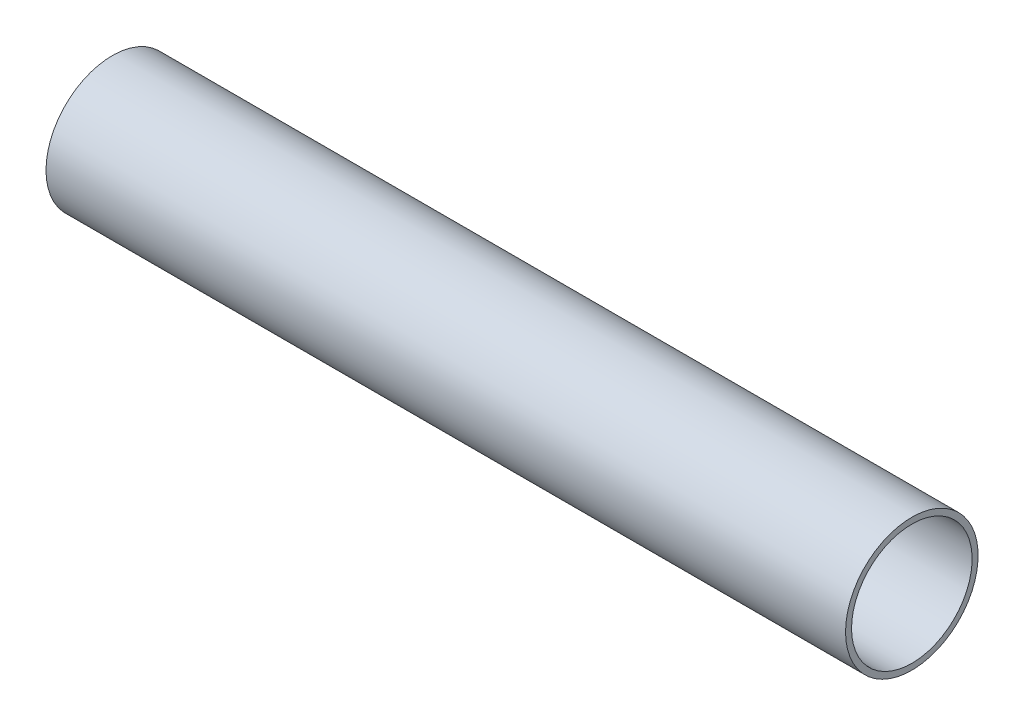
ISO-10303-21;
HEADER;
FILE_DESCRIPTION(('STEP AP214'),'2;1');
FILE_NAME('part.step','',(''),(''),'','','');
FILE_SCHEMA(('AUTOMOTIVE_DESIGN { 1 0 10303 214 1 1 1 1 }'));
ENDSEC;
DATA;
#1=APPLICATION_CONTEXT('core data for automotive mechanical design processes');
#2=APPLICATION_PROTOCOL_DEFINITION('international standard','automotive_design',2000,#1);
#3=PRODUCT_CONTEXT('',#1,'mechanical');
#4=PRODUCT('Part','Part','',(#3));
#5=PRODUCT_RELATED_PRODUCT_CATEGORY('part','',(#4));
#6=PRODUCT_DEFINITION_FORMATION('','',#4);
#7=PRODUCT_DEFINITION_CONTEXT('part definition',#1,'design');
#8=PRODUCT_DEFINITION('design','',#6,#7);
#9=PRODUCT_DEFINITION_SHAPE('','',#8);
#10=(LENGTH_UNIT() NAMED_UNIT(*) SI_UNIT(.MILLI.,.METRE.));
#11=(NAMED_UNIT(*) PLANE_ANGLE_UNIT() SI_UNIT($,.RADIAN.));
#12=(NAMED_UNIT(*) SI_UNIT($,.STERADIAN.) SOLID_ANGLE_UNIT());
#13=UNCERTAINTY_MEASURE_WITH_UNIT(LENGTH_MEASURE(1.E-05),#10,'distance_accuracy_value','');
#14=(GEOMETRIC_REPRESENTATION_CONTEXT(3) GLOBAL_UNCERTAINTY_ASSIGNED_CONTEXT((#13)) GLOBAL_UNIT_ASSIGNED_CONTEXT((#10,
#11,#12)) REPRESENTATION_CONTEXT('',''));
#15=CARTESIAN_POINT('',(0.,0.,0.));
#16=DIRECTION('',(0.,0.,1.));
#17=DIRECTION('',(1.,0.,0.));
#18=AXIS2_PLACEMENT_3D('',#15,#16,#17);
#19=CARTESIAN_POINT('',(76.2,0.,0.));
#20=DIRECTION('',(1.,0.,0.));
#21=DIRECTION('',(0.,0.,-1.));
#22=AXIS2_PLACEMENT_3D('',#19,#20,#21);
#23=PLANE('',#22);
#24=CARTESIAN_POINT('',(76.2,0.,0.));
#25=DIRECTION('',(1.,0.,0.));
#26=DIRECTION('',(0.,0.,-1.));
#27=AXIS2_PLACEMENT_3D('',#24,#25,#26);
#28=CIRCLE('',#27,12.6365);
#29=CARTESIAN_POINT('',(76.2,0.,12.6365));
#30=VERTEX_POINT('',#29);
#31=EDGE_CURVE('E12',#30,#30,#28,.T.);
#32=ORIENTED_EDGE('',*,*,#31,.T.);
#33=EDGE_LOOP('',(#32));
#34=FACE_BOUND('',#33,.T.);
#35=CARTESIAN_POINT('',(76.2,0.,0.));
#36=DIRECTION('',(1.,0.,0.));
#37=DIRECTION('',(0.,0.,-1.));
#38=AXIS2_PLACEMENT_3D('',#35,#36,#37);
#39=CIRCLE('',#38,11.4935);
#40=CARTESIAN_POINT('',(76.2,0.,11.4935));
#41=VERTEX_POINT('',#40);
#42=EDGE_CURVE('E56',#41,#41,#39,.T.);
#43=ORIENTED_EDGE('',*,*,#42,.F.);
#44=EDGE_LOOP('',(#43));
#45=FACE_BOUND('',#44,.T.);
#46=ADVANCED_FACE('F45',(#34,#45),#23,.T.);
#47=CARTESIAN_POINT('',(-76.2,0.,0.));
#48=DIRECTION('',(1.,0.,0.));
#49=DIRECTION('',(0.,0.,-1.));
#50=AXIS2_PLACEMENT_3D('',#47,#48,#49);
#51=PLANE('',#50);
#52=CARTESIAN_POINT('',(-76.2,0.,0.));
#53=DIRECTION('',(1.,0.,0.));
#54=DIRECTION('',(0.,0.,-1.));
#55=AXIS2_PLACEMENT_3D('',#52,#53,#54);
#56=CIRCLE('',#55,12.6365);
#57=CARTESIAN_POINT('',(-76.2,0.,12.6365));
#58=VERTEX_POINT('',#57);
#59=EDGE_CURVE('E49',#58,#58,#56,.T.);
#60=ORIENTED_EDGE('',*,*,#59,.F.);
#61=EDGE_LOOP('',(#60));
#62=FACE_BOUND('',#61,.T.);
#63=CARTESIAN_POINT('',(-76.2,0.,0.));
#64=DIRECTION('',(1.,0.,0.));
#65=DIRECTION('',(0.,0.,-1.));
#66=AXIS2_PLACEMENT_3D('',#63,#64,#65);
#67=CIRCLE('',#66,11.4935);
#68=CARTESIAN_POINT('',(-76.2,0.,11.4935));
#69=VERTEX_POINT('',#68);
#70=EDGE_CURVE('E58',#69,#69,#67,.T.);
#71=ORIENTED_EDGE('',*,*,#70,.T.);
#72=EDGE_LOOP('',(#71));
#73=FACE_BOUND('',#72,.T.);
#74=ADVANCED_FACE('F68',(#62,#73),#51,.F.);
#75=CARTESIAN_POINT('',(76.2,0.,0.));
#76=DIRECTION('',(-1.,0.,0.));
#77=DIRECTION('',(0.,0.,1.));
#78=AXIS2_PLACEMENT_3D('',#75,#76,#77);
#79=CYLINDRICAL_SURFACE('',#78,12.6365);
#80=CARTESIAN_POINT('',(76.2,0.,12.6365));
#81=CARTESIAN_POINT('',(74.6125,0.,12.6365));
#82=CARTESIAN_POINT('',(73.025,0.,12.6365));
#83=CARTESIAN_POINT('',(69.85,0.,12.6365));
#84=CARTESIAN_POINT('',(68.2625,0.,12.6365));
#85=CARTESIAN_POINT('',(65.0875,0.,12.6365));
#86=CARTESIAN_POINT('',(63.5,0.,12.6365));
#87=CARTESIAN_POINT('',(60.325,0.,12.6365));
#88=CARTESIAN_POINT('',(58.7375,0.,12.6365));
#89=CARTESIAN_POINT('',(55.5625,0.,12.6365));
#90=CARTESIAN_POINT('',(53.975,0.,12.6365));
#91=CARTESIAN_POINT('',(50.8,0.,12.6365));
#92=CARTESIAN_POINT('',(49.2125,0.,12.6365));
#93=CARTESIAN_POINT('',(46.0375,0.,12.6365));
#94=CARTESIAN_POINT('',(44.45,0.,12.6365));
#95=CARTESIAN_POINT('',(41.275,0.,12.6365));
#96=CARTESIAN_POINT('',(39.6875,0.,12.6365));
#97=CARTESIAN_POINT('',(36.5125,0.,12.6365));
#98=CARTESIAN_POINT('',(34.925,0.,12.6365));
#99=CARTESIAN_POINT('',(31.75,0.,12.6365));
#100=CARTESIAN_POINT('',(30.1625,0.,12.6365));
#101=CARTESIAN_POINT('',(26.9875,0.,12.6365));
#102=CARTESIAN_POINT('',(25.4,0.,12.6365));
#103=CARTESIAN_POINT('',(22.225,0.,12.6365));
#104=CARTESIAN_POINT('',(20.6375,0.,12.6365));
#105=CARTESIAN_POINT('',(17.4625,0.,12.6365));
#106=CARTESIAN_POINT('',(15.875,0.,12.6365));
#107=CARTESIAN_POINT('',(12.7,0.,12.6365));
#108=CARTESIAN_POINT('',(11.1125,0.,12.6365));
#109=CARTESIAN_POINT('',(7.93750000000001,0.,12.6365));
#110=CARTESIAN_POINT('',(6.35,0.,12.6365));
#111=CARTESIAN_POINT('',(3.175,0.,12.6365));
#112=CARTESIAN_POINT('',(1.5875,0.,12.6365));
#113=CARTESIAN_POINT('',(-1.5875,0.,12.6365));
#114=CARTESIAN_POINT('',(-3.175,0.,12.6365));
#115=CARTESIAN_POINT('',(-6.35,0.,12.6365));
#116=CARTESIAN_POINT('',(-7.93750000000001,0.,12.6365));
#117=CARTESIAN_POINT('',(-11.1125,0.,12.6365));
#118=CARTESIAN_POINT('',(-12.7,0.,12.6365));
#119=CARTESIAN_POINT('',(-15.875,0.,12.6365));
#120=CARTESIAN_POINT('',(-17.4625,0.,12.6365));
#121=CARTESIAN_POINT('',(-20.6375,0.,12.6365));
#122=CARTESIAN_POINT('',(-22.225,0.,12.6365));
#123=CARTESIAN_POINT('',(-25.4,0.,12.6365));
#124=CARTESIAN_POINT('',(-26.9875,0.,12.6365));
#125=CARTESIAN_POINT('',(-30.1625,0.,12.6365));
#126=CARTESIAN_POINT('',(-31.75,0.,12.6365));
#127=CARTESIAN_POINT('',(-34.925,0.,12.6365));
#128=CARTESIAN_POINT('',(-36.5125,0.,12.6365));
#129=CARTESIAN_POINT('',(-39.6875,0.,12.6365));
#130=CARTESIAN_POINT('',(-41.275,0.,12.6365));
#131=CARTESIAN_POINT('',(-44.45,0.,12.6365));
#132=CARTESIAN_POINT('',(-46.0375,0.,12.6365));
#133=CARTESIAN_POINT('',(-49.2125,0.,12.6365));
#134=CARTESIAN_POINT('',(-50.8,0.,12.6365));
#135=CARTESIAN_POINT('',(-53.975,0.,12.6365));
#136=CARTESIAN_POINT('',(-55.5625,0.,12.6365));
#137=CARTESIAN_POINT('',(-58.7375,0.,12.6365));
#138=CARTESIAN_POINT('',(-60.325,0.,12.6365));
#139=CARTESIAN_POINT('',(-63.5,0.,12.6365));
#140=CARTESIAN_POINT('',(-65.0875,0.,12.6365));
#141=CARTESIAN_POINT('',(-68.2625,0.,12.6365));
#142=CARTESIAN_POINT('',(-69.85,0.,12.6365));
#143=CARTESIAN_POINT('',(-73.025,0.,12.6365));
#144=CARTESIAN_POINT('',(-74.6125,0.,12.6365));
#145=CARTESIAN_POINT('',(-76.2,0.,12.6365));
#146=B_SPLINE_CURVE_WITH_KNOTS('',3,(#80,#81,#82,#83,#84,#85,#86,#87,#88,#89,#90,#91,#92,#93,
#94,#95,#96,#97,#98,#99,#100,#101,#102,#103,#104,#105,#106,#107,#108,#109,#110,#111,#112,#113,
#114,#115,#116,#117,#118,#119,#120,#121,#122,#123,#124,#125,#126,#127,#128,#129,#130,#131,#132,
#133,#134,#135,#136,#137,#138,#139,#140,#141,#142,#143,#144,#145),.UNSPECIFIED.,.F.,.F.,(4,2,2,
2,2,2,2,2,2,2,2,2,2,2,2,2,2,2,2,2,2,2,2,2,2,2,2,2,2,2,2,2,4),(0.,4.7625,9.52500000000001,
14.2875,19.05,23.8125,28.575,33.3375,38.1,42.8625,47.625,52.3875,57.15,61.9125,66.675,71.4375,
76.2,80.9625,85.725,90.4875,95.25,100.0125,104.775,109.5375,114.3,119.0625,123.825,128.5875,
133.35,138.1125,142.875,147.6375,152.4),.UNSPECIFIED.);
#147=EDGE_CURVE('BSEAM47',#30,#58,#146,.T.);
#148=ORIENTED_EDGE('',*,*,#31,.F.);
#149=ORIENTED_EDGE('',*,*,#59,.T.);
#150=ORIENTED_EDGE('',*,*,#147,.T.);
#151=ORIENTED_EDGE('',*,*,#147,.F.);
#152=EDGE_LOOP('',(#148,#150,#149,#151));
#153=FACE_BOUND('',#152,.T.);
#154=ADVANCED_FACE('F47',(#153),#79,.T.);
#155=CARTESIAN_POINT('',(76.2,0.,0.));
#156=DIRECTION('',(-1.,0.,0.));
#157=DIRECTION('',(0.,0.,1.));
#158=AXIS2_PLACEMENT_3D('',#155,#156,#157);
#159=CYLINDRICAL_SURFACE('',#158,11.4935);
#160=CARTESIAN_POINT('',(76.2,0.,11.4935));
#161=CARTESIAN_POINT('',(74.6125,0.,11.4935));
#162=CARTESIAN_POINT('',(73.025,0.,11.4935));
#163=CARTESIAN_POINT('',(69.85,0.,11.4935));
#164=CARTESIAN_POINT('',(68.2625,0.,11.4935));
#165=CARTESIAN_POINT('',(65.0875,0.,11.4935));
#166=CARTESIAN_POINT('',(63.5,0.,11.4935));
#167=CARTESIAN_POINT('',(60.325,0.,11.4935));
#168=CARTESIAN_POINT('',(58.7375,0.,11.4935));
#169=CARTESIAN_POINT('',(55.5625,0.,11.4935));
#170=CARTESIAN_POINT('',(53.975,0.,11.4935));
#171=CARTESIAN_POINT('',(50.8,0.,11.4935));
#172=CARTESIAN_POINT('',(49.2125,0.,11.4935));
#173=CARTESIAN_POINT('',(46.0375,0.,11.4935));
#174=CARTESIAN_POINT('',(44.45,0.,11.4935));
#175=CARTESIAN_POINT('',(41.275,0.,11.4935));
#176=CARTESIAN_POINT('',(39.6875,0.,11.4935));
#177=CARTESIAN_POINT('',(36.5125,0.,11.4935));
#178=CARTESIAN_POINT('',(34.925,0.,11.4935));
#179=CARTESIAN_POINT('',(31.75,0.,11.4935));
#180=CARTESIAN_POINT('',(30.1625,0.,11.4935));
#181=CARTESIAN_POINT('',(26.9875,0.,11.4935));
#182=CARTESIAN_POINT('',(25.4,0.,11.4935));
#183=CARTESIAN_POINT('',(22.225,0.,11.4935));
#184=CARTESIAN_POINT('',(20.6375,0.,11.4935));
#185=CARTESIAN_POINT('',(17.4625,0.,11.4935));
#186=CARTESIAN_POINT('',(15.875,0.,11.4935));
#187=CARTESIAN_POINT('',(12.7,0.,11.4935));
#188=CARTESIAN_POINT('',(11.1125,0.,11.4935));
#189=CARTESIAN_POINT('',(7.93750000000001,0.,11.4935));
#190=CARTESIAN_POINT('',(6.35,0.,11.4935));
#191=CARTESIAN_POINT('',(3.175,0.,11.4935));
#192=CARTESIAN_POINT('',(1.5875,0.,11.4935));
#193=CARTESIAN_POINT('',(-1.5875,0.,11.4935));
#194=CARTESIAN_POINT('',(-3.175,0.,11.4935));
#195=CARTESIAN_POINT('',(-6.35,0.,11.4935));
#196=CARTESIAN_POINT('',(-7.93750000000001,0.,11.4935));
#197=CARTESIAN_POINT('',(-11.1125,0.,11.4935));
#198=CARTESIAN_POINT('',(-12.7,0.,11.4935));
#199=CARTESIAN_POINT('',(-15.875,0.,11.4935));
#200=CARTESIAN_POINT('',(-17.4625,0.,11.4935));
#201=CARTESIAN_POINT('',(-20.6375,0.,11.4935));
#202=CARTESIAN_POINT('',(-22.225,0.,11.4935));
#203=CARTESIAN_POINT('',(-25.4,0.,11.4935));
#204=CARTESIAN_POINT('',(-26.9875,0.,11.4935));
#205=CARTESIAN_POINT('',(-30.1625,0.,11.4935));
#206=CARTESIAN_POINT('',(-31.75,0.,11.4935));
#207=CARTESIAN_POINT('',(-34.925,0.,11.4935));
#208=CARTESIAN_POINT('',(-36.5125,0.,11.4935));
#209=CARTESIAN_POINT('',(-39.6875,0.,11.4935));
#210=CARTESIAN_POINT('',(-41.275,0.,11.4935));
#211=CARTESIAN_POINT('',(-44.45,0.,11.4935));
#212=CARTESIAN_POINT('',(-46.0375,0.,11.4935));
#213=CARTESIAN_POINT('',(-49.2125,0.,11.4935));
#214=CARTESIAN_POINT('',(-50.8,0.,11.4935));
#215=CARTESIAN_POINT('',(-53.975,0.,11.4935));
#216=CARTESIAN_POINT('',(-55.5625,0.,11.4935));
#217=CARTESIAN_POINT('',(-58.7375,0.,11.4935));
#218=CARTESIAN_POINT('',(-60.325,0.,11.4935));
#219=CARTESIAN_POINT('',(-63.5,0.,11.4935));
#220=CARTESIAN_POINT('',(-65.0875,0.,11.4935));
#221=CARTESIAN_POINT('',(-68.2625,0.,11.4935));
#222=CARTESIAN_POINT('',(-69.85,0.,11.4935));
#223=CARTESIAN_POINT('',(-73.025,0.,11.4935));
#224=CARTESIAN_POINT('',(-74.6125,0.,11.4935));
#225=CARTESIAN_POINT('',(-76.2,0.,11.4935));
#226=B_SPLINE_CURVE_WITH_KNOTS('',3,(#160,#161,#162,#163,#164,#165,#166,#167,#168,#169,#170,
#171,#172,#173,#174,#175,#176,#177,#178,#179,#180,#181,#182,#183,#184,#185,#186,#187,#188,#189,
#190,#191,#192,#193,#194,#195,#196,#197,#198,#199,#200,#201,#202,#203,#204,#205,#206,#207,#208,
#209,#210,#211,#212,#213,#214,#215,#216,#217,#218,#219,#220,#221,#222,#223,#224,#225),
.UNSPECIFIED.,.F.,.F.,(4,2,2,2,2,2,2,2,2,2,2,2,2,2,2,2,2,2,2,2,2,2,2,2,2,2,2,2,2,2,2,2,4),(0.,
4.7625,9.52500000000001,14.2875,19.05,23.8125,28.575,33.3375,38.1,42.8625,47.625,52.3875,57.15,
61.9125,66.675,71.4375,76.2,80.9625,85.725,90.4875,95.25,100.0125,104.775,109.5375,114.3,
119.0625,123.825,128.5875,133.35,138.1125,142.875,147.6375,152.4),.UNSPECIFIED.);
#227=EDGE_CURVE('BSEAM64',#41,#69,#226,.T.);
#228=ORIENTED_EDGE('',*,*,#42,.T.);
#229=ORIENTED_EDGE('',*,*,#70,.F.);
#230=ORIENTED_EDGE('',*,*,#227,.T.);
#231=ORIENTED_EDGE('',*,*,#227,.F.);
#232=EDGE_LOOP('',(#228,#230,#229,#231));
#233=FACE_BOUND('',#232,.T.);
#234=ADVANCED_FACE('F64',(#233),#159,.F.);
#235=CLOSED_SHELL('',(#46,#74,#154,#234));
#236=MANIFOLD_SOLID_BREP('B2',#235);
#237=ADVANCED_BREP_SHAPE_REPRESENTATION('',(#18,#236),#14);
#238=SHAPE_DEFINITION_REPRESENTATION(#9,#237);
ENDSEC;
END-ISO-10303-21;
